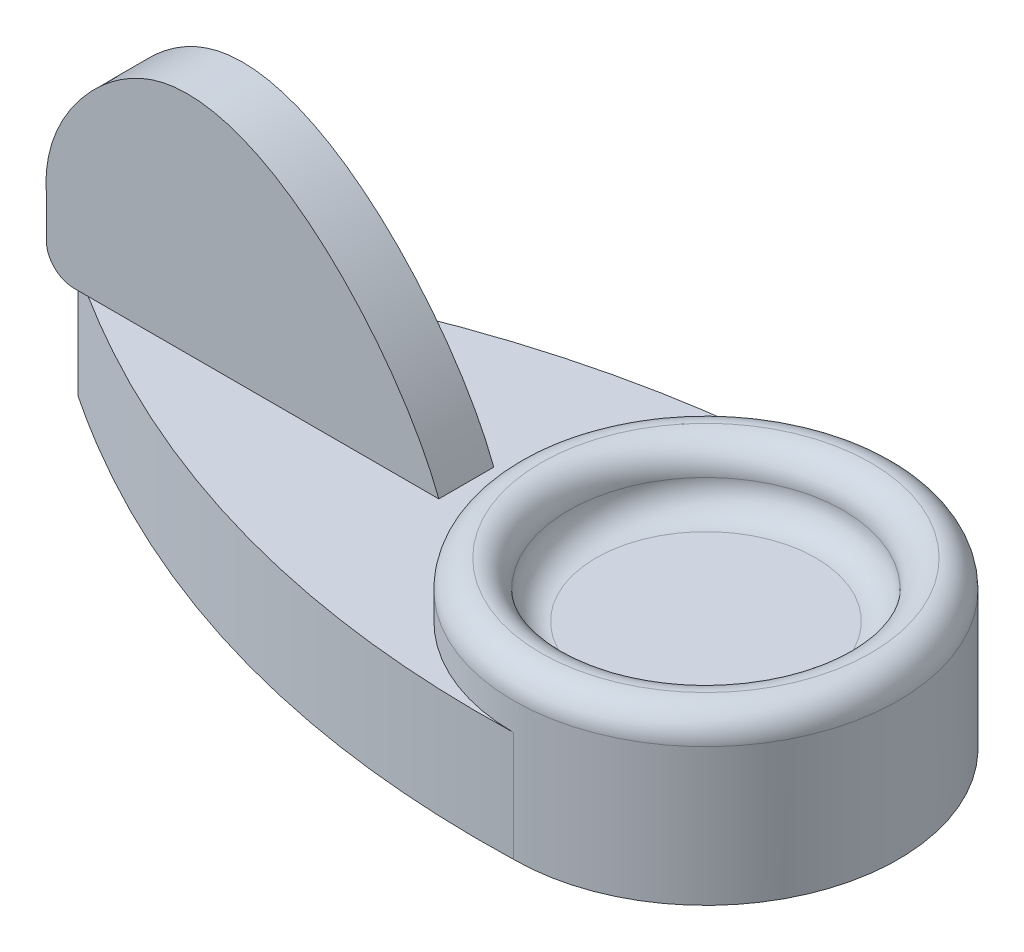
ISO-10303-21;
HEADER;
FILE_DESCRIPTION(('STEP AP214'),'2;1');
FILE_NAME('part.step','',(''),(''),'','','');
FILE_SCHEMA(('AUTOMOTIVE_DESIGN { 1 0 10303 214 1 1 1 1 }'));
ENDSEC;
DATA;
#1=APPLICATION_CONTEXT('core data for automotive mechanical design processes');
#2=APPLICATION_PROTOCOL_DEFINITION('international standard','automotive_design',2000,#1);
#3=PRODUCT_CONTEXT('',#1,'mechanical');
#4=PRODUCT('Part','Part','',(#3));
#5=PRODUCT_RELATED_PRODUCT_CATEGORY('part','',(#4));
#6=PRODUCT_DEFINITION_FORMATION('','',#4);
#7=PRODUCT_DEFINITION_CONTEXT('part definition',#1,'design');
#8=PRODUCT_DEFINITION('design','',#6,#7);
#9=PRODUCT_DEFINITION_SHAPE('','',#8);
#10=(LENGTH_UNIT() NAMED_UNIT(*) SI_UNIT(.MILLI.,.METRE.));
#11=(NAMED_UNIT(*) PLANE_ANGLE_UNIT() SI_UNIT($,.RADIAN.));
#12=(NAMED_UNIT(*) SI_UNIT($,.STERADIAN.) SOLID_ANGLE_UNIT());
#13=UNCERTAINTY_MEASURE_WITH_UNIT(LENGTH_MEASURE(1.E-05),#10,'distance_accuracy_value','');
#14=(GEOMETRIC_REPRESENTATION_CONTEXT(3) GLOBAL_UNCERTAINTY_ASSIGNED_CONTEXT((#13)) GLOBAL_UNIT_ASSIGNED_CONTEXT((#10,
#11,#12)) REPRESENTATION_CONTEXT('',''));
#15=CARTESIAN_POINT('',(0.,0.,0.));
#16=DIRECTION('',(0.,0.,1.));
#17=DIRECTION('',(1.,0.,0.));
#18=AXIS2_PLACEMENT_3D('',#15,#16,#17);
#19=CARTESIAN_POINT('',(0.,2.,-3.5));
#20=CARTESIAN_POINT('',(-6.12662455637895,2.,-3.68191208845237));
#21=CARTESIAN_POINT('',(-11.5,2.,0.));
#22=B_SPLINE_CURVE_WITH_KNOTS('',2,(#19,#20,#21),.UNSPECIFIED.,.F.,.F.,(3,3),(0.,1.),.UNSPECIFIED.);
#23=DIRECTION('',(0.,-1.,0.));
#24=VECTOR('',#23,1.);
#25=SURFACE_OF_LINEAR_EXTRUSION('',#22,#24);
#26=CARTESIAN_POINT('',(0.,0.,-3.5));
#27=CARTESIAN_POINT('',(-6.12662455637895,0.,-3.68191208845237));
#28=CARTESIAN_POINT('',(-11.5,0.,0.));
#29=B_SPLINE_CURVE_WITH_KNOTS('',2,(#26,#27,#28),.UNSPECIFIED.,.F.,.F.,(3,3),(0.,1.),.UNSPECIFIED.);
#30=CARTESIAN_POINT('',(0.,0.,-3.5));
#31=VERTEX_POINT('',#30);
#32=CARTESIAN_POINT('',(-11.2537930165559,0.,-0.166412944091893));
#33=VERTEX_POINT('',#32);
#34=EDGE_CURVE('E227',#31,#33,#29,.T.);
#35=ORIENTED_EDGE('',*,*,#34,.T.);
#36=DIRECTION('',(0.,-1.,0.));
#37=VECTOR('',#36,1.);
#38=CARTESIAN_POINT('',(-11.2537930165559,0.,-0.166412944091893));
#39=LINE('',#38,#37);
#40=CARTESIAN_POINT('',(-11.2537930165559,2.06919946059987,-0.166412944091893));
#41=VERTEX_POINT('',#40);
#42=EDGE_CURVE('E64',#33,#41,#39,.F.);
#43=ORIENTED_EDGE('',*,*,#42,.T.);
#44=CARTESIAN_POINT('',(-11.5,2.5,0.));
#45=CARTESIAN_POINT('',(-11.5000342115577,2.47530984891668,2.48383133919638E-05));
#46=CARTESIAN_POINT('',(-11.498173484816,2.4506571947434,-0.00125156162960289));
#47=CARTESIAN_POINT('',(-11.4909493854543,2.40225076338282,-0.00619935642048918));
#48=CARTESIAN_POINT('',(-11.4856052213293,2.37849280815618,-0.00985761700405208));
#49=CARTESIAN_POINT('',(-11.4717054096251,2.33244604006634,-0.0193591900303991));
#50=CARTESIAN_POINT('',(-11.4631541533999,2.31015526708196,-0.0251995146113813));
#51=CARTESIAN_POINT('',(-11.4432647767751,2.26746489563335,-0.0387575875231119));
#52=CARTESIAN_POINT('',(-11.431923337873,2.24706758924352,-0.0464775713121345));
#53=CARTESIAN_POINT('',(-11.3927428537743,2.1867249822323,-0.0730849387838425));
#54=CARTESIAN_POINT('',(-11.3607152993738,2.15065397805925,-0.0947531550935584));
#55=CARTESIAN_POINT('',(-11.2839987870565,2.08487893974673,-0.14630628510141));
#56=CARTESIAN_POINT('',(-11.2380866904511,2.05726231912831,-0.176960024748382));
#57=CARTESIAN_POINT('',(-11.1595046322122,2.02497827944877,-0.228970035971846));
#58=CARTESIAN_POINT('',(-11.128155543699,2.01560856743447,-0.249611768825755));
#59=CARTESIAN_POINT('',(-11.0645637467219,2.00313748415825,-0.291255288677737));
#60=CARTESIAN_POINT('',(-11.032323232499,2.00002190689528,-0.312256150154804));
#61=CARTESIAN_POINT('',(-11.,2.,-0.333187298877784));
#62=B_SPLINE_CURVE_WITH_KNOTS('',3,(#44,#45,#46,#47,#48,#49,#50,#51,#52,#53,#54,#55,#56,#57,#58,
#59,#60,#61),.UNSPECIFIED.,.F.,.F.,(4,2,2,2,2,2,2,2,4),(0.,0.0739080321765246,0.147411926977707,
0.220815540871396,0.294306882995868,0.450616503362289,0.633183557091156,0.748776335070717,
0.864106250511664),.UNSPECIFIED.);
#63=CARTESIAN_POINT('',(-11.0000000000001,2.,-0.333187298877697));
#64=VERTEX_POINT('',#63);
#65=EDGE_CURVE('E189',#41,#64,#62,.T.);
#66=ORIENTED_EDGE('',*,*,#65,.T.);
#67=CARTESIAN_POINT('',(-10.7385233750624,2.,-0.5));
#68=VERTEX_POINT('',#67);
#69=EDGE_CURVE('E169',#68,#64,#22,.T.);
#70=ORIENTED_EDGE('',*,*,#69,.F.);
#71=CARTESIAN_POINT('',(0.,2.,-3.5));
#72=VERTEX_POINT('',#71);
#73=EDGE_CURVE('E163',#72,#68,#22,.T.);
#74=ORIENTED_EDGE('',*,*,#73,.F.);
#75=DIRECTION('',(0.,-1.,0.));
#76=VECTOR('',#75,1.);
#77=CARTESIAN_POINT('',(0.,2.,-3.5));
#78=LINE('',#77,#76);
#79=EDGE_CURVE('E238',#72,#31,#78,.T.);
#80=ORIENTED_EDGE('',*,*,#79,.T.);
#81=EDGE_LOOP('',(#35,#43,#66,#70,#74,#80));
#82=FACE_BOUND('',#81,.T.);
#83=ADVANCED_FACE('F40',(#82),#25,.F.);
#84=CARTESIAN_POINT('',(0.,2.,3.5));
#85=CARTESIAN_POINT('',(-6.12662455637895,2.,3.68191208845237));
#86=CARTESIAN_POINT('',(-11.5,2.,0.));
#87=B_SPLINE_CURVE_WITH_KNOTS('',2,(#84,#85,#86),.UNSPECIFIED.,.F.,.F.,(3,3),(0.,1.),.UNSPECIFIED.);
#88=DIRECTION('',(0.,-1.,0.));
#89=VECTOR('',#88,1.);
#90=SURFACE_OF_LINEAR_EXTRUSION('',#87,#89);
#91=CARTESIAN_POINT('',(-11.,2.,0.333187298877786));
#92=CARTESIAN_POINT('',(-11.0178189687918,2.0000010117855,0.321647109079927));
#93=CARTESIAN_POINT('',(-11.0356212645693,2.00095266382482,0.310081519787242));
#94=CARTESIAN_POINT('',(-11.0710193700797,2.00474970720833,0.287014902992967));
#95=CARTESIAN_POINT('',(-11.0886154904419,2.00759173145211,0.275513797299421));
#96=CARTESIAN_POINT('',(-11.1236328058006,2.01519248930718,0.252557802153845));
#97=CARTESIAN_POINT('',(-11.1410514521667,2.01996646911054,0.241104030148324));
#98=CARTESIAN_POINT('',(-11.1754482917191,2.03144093393052,0.218420624183987));
#99=CARTESIAN_POINT('',(-11.1924253803144,2.0381458224744,0.207191566016232));
#100=CARTESIAN_POINT('',(-11.2397788061437,2.05994647440805,0.175782987082251));
#101=CARTESIAN_POINT('',(-11.2694114000479,2.07735578214267,0.156021465064425));
#102=CARTESIAN_POINT('',(-11.3252370877127,2.11865840070362,0.118623620654779));
#103=CARTESIAN_POINT('',(-11.3514388072831,2.14253496861813,0.100981978094591));
#104=CARTESIAN_POINT('',(-11.3918387484425,2.18839583926509,0.0736811137641697));
#105=CARTESIAN_POINT('',(-11.4072824526681,2.20880761749144,0.0632131014388433));
#106=CARTESIAN_POINT('',(-11.4351845698841,2.25244446777527,0.0442606082705913));
#107=CARTESIAN_POINT('',(-11.4476426146751,2.27566988628717,0.0357763720753504));
#108=CARTESIAN_POINT('',(-11.4690074586984,2.32463937241546,0.0212045031108009));
#109=CARTESIAN_POINT('',(-11.4778864258101,2.35040131148765,0.0151356576759938));
#110=CARTESIAN_POINT('',(-11.4913568961627,2.40349422783249,0.00592131537121679));
#111=CARTESIAN_POINT('',(-11.4959599047993,2.43082078332659,0.00276797381272133));
#112=CARTESIAN_POINT('',(-11.498843182324,2.46529613667982,0.000792614147605484));
#113=CARTESIAN_POINT('',(-11.4992769832548,2.47223120419034,0.000495399207977034));
#114=CARTESIAN_POINT('',(-11.499854902603,2.48610975620824,9.9430485872398E-05));
#115=CARTESIAN_POINT('',(-11.4999994080909,2.49305321701465,4.11521873627771E-07));
#116=CARTESIAN_POINT('',(-11.5,2.5,0.));
#117=B_SPLINE_CURVE_WITH_KNOTS('',3,(#91,#92,#93,#94,#95,#96,#97,#98,#99,#100,#101,#102,#103,
#104,#105,#106,#107,#108,#109,#110,#111,#112,#113,#114,#115,#116),.UNSPECIFIED.,.F.,.F.,(4,2,2,
2,2,2,2,2,2,2,2,2,4),(0.,0.0636667112676558,0.127220323013127,0.1912855702723,0.255498094257199,
0.373734269404229,0.491667224448291,0.574302800189985,0.65694856153256,0.740225149665953,
0.823277009439444,0.844136449247156,0.864967960912051),.UNSPECIFIED.);
#118=CARTESIAN_POINT('',(-11.,2.,0.333187298877786));
#119=VERTEX_POINT('',#118);
#120=CARTESIAN_POINT('',(-11.2537930165561,2.06919946059995,0.166412944091806));
#121=VERTEX_POINT('',#120);
#122=EDGE_CURVE('E56',#119,#121,#117,.T.);
#123=ORIENTED_EDGE('',*,*,#122,.T.);
#124=DIRECTION('',(0.,-1.,0.));
#125=VECTOR('',#124,1.);
#126=CARTESIAN_POINT('',(-11.2537930165559,2.06919946059995,0.166412944091895));
#127=LINE('',#126,#125);
#128=CARTESIAN_POINT('',(-11.2537930165559,0.,0.166412944091895));
#129=VERTEX_POINT('',#128);
#130=EDGE_CURVE('E195',#121,#129,#127,.T.);
#131=ORIENTED_EDGE('',*,*,#130,.T.);
#132=CARTESIAN_POINT('',(0.,0.,3.5));
#133=CARTESIAN_POINT('',(-6.12662455637895,0.,3.68191208845237));
#134=CARTESIAN_POINT('',(-11.5,0.,0.));
#135=B_SPLINE_CURVE_WITH_KNOTS('',2,(#132,#133,#134),.UNSPECIFIED.,.F.,.F.,(3,3),(0.,1.),.UNSPECIFIED.);
#136=CARTESIAN_POINT('',(0.,0.,3.5));
#137=VERTEX_POINT('',#136);
#138=EDGE_CURVE('E221',#137,#129,#135,.T.);
#139=ORIENTED_EDGE('',*,*,#138,.F.);
#140=DIRECTION('',(0.,-1.,0.));
#141=VECTOR('',#140,1.);
#142=CARTESIAN_POINT('',(0.,2.,3.5));
#143=LINE('',#142,#141);
#144=CARTESIAN_POINT('',(0.,2.,3.5));
#145=VERTEX_POINT('',#144);
#146=EDGE_CURVE('E162',#145,#137,#143,.T.);
#147=ORIENTED_EDGE('',*,*,#146,.F.);
#148=CARTESIAN_POINT('',(-10.7385233750624,2.,0.5));
#149=VERTEX_POINT('',#148);
#150=EDGE_CURVE('E170',#145,#149,#87,.T.);
#151=ORIENTED_EDGE('',*,*,#150,.T.);
#152=EDGE_CURVE('E168',#149,#119,#87,.T.);
#153=ORIENTED_EDGE('',*,*,#152,.T.);
#154=EDGE_LOOP('',(#123,#131,#139,#147,#151,#153));
#155=FACE_BOUND('',#154,.T.);
#156=ADVANCED_FACE('F183',(#155),#90,.T.);
#157=CARTESIAN_POINT('',(0.,2.,0.));
#158=DIRECTION('',(0.,-1.,0.));
#159=DIRECTION('',(0.,0.,-1.));
#160=AXIS2_PLACEMENT_3D('',#157,#158,#159);
#161=CYLINDRICAL_SURFACE('',#160,3.5);
#162=CARTESIAN_POINT('',(0.,2.5,0.));
#163=DIRECTION('',(0.,1.,0.));
#164=DIRECTION('',(0.,0.,1.));
#165=AXIS2_PLACEMENT_3D('',#162,#163,#164);
#166=CIRCLE('',#165,3.5);
#167=CARTESIAN_POINT('',(0.,2.5,3.5));
#168=VERTEX_POINT('',#167);
#169=EDGE_CURVE('E244',#168,#168,#166,.F.);
#170=ORIENTED_EDGE('',*,*,#169,.T.);
#171=EDGE_LOOP('',(#170));
#172=FACE_BOUND('',#171,.T.);
#173=CARTESIAN_POINT('',(0.,0.,0.));
#174=DIRECTION('',(0.,1.,0.));
#175=DIRECTION('',(0.,0.,1.));
#176=AXIS2_PLACEMENT_3D('',#173,#174,#175);
#177=CIRCLE('',#176,3.5);
#178=EDGE_CURVE('E226',#137,#31,#177,.T.);
#179=ORIENTED_EDGE('',*,*,#178,.T.);
#180=ORIENTED_EDGE('',*,*,#79,.F.);
#181=CARTESIAN_POINT('',(0.,2.,0.));
#182=DIRECTION('',(0.,1.,0.));
#183=DIRECTION('',(0.,0.,1.));
#184=AXIS2_PLACEMENT_3D('',#181,#182,#183);
#185=CIRCLE('',#184,3.5);
#186=EDGE_CURVE('E158',#72,#145,#185,.T.);
#187=ORIENTED_EDGE('',*,*,#186,.T.);
#188=ORIENTED_EDGE('',*,*,#146,.T.);
#189=EDGE_LOOP('',(#179,#180,#187,#188));
#190=FACE_BOUND('',#189,.T.);
#191=ADVANCED_FACE('F294',(#172,#190),#161,.T.);
#192=CARTESIAN_POINT('',(0.,2.,0.));
#193=DIRECTION('',(0.,1.,0.));
#194=DIRECTION('',(0.,0.,1.));
#195=AXIS2_PLACEMENT_3D('',#192,#193,#194);
#196=PLANE('',#195);
#197=DIRECTION('',(1.,0.,0.));
#198=VECTOR('',#197,1.);
#199=CARTESIAN_POINT('',(0.,2.,0.5));
#200=LINE('',#199,#198);
#201=CARTESIAN_POINT('',(-4.35975113165469,2.,0.5));
#202=VERTEX_POINT('',#201);
#203=EDGE_CURVE('E122',#149,#202,#200,.T.);
#204=ORIENTED_EDGE('',*,*,#203,.F.);
#205=ORIENTED_EDGE('',*,*,#150,.F.);
#206=ORIENTED_EDGE('',*,*,#186,.F.);
#207=ORIENTED_EDGE('',*,*,#73,.T.);
#208=DIRECTION('',(1.,0.,0.));
#209=VECTOR('',#208,1.);
#210=CARTESIAN_POINT('',(0.,2.,-0.5));
#211=LINE('',#210,#209);
#212=CARTESIAN_POINT('',(-4.35975113165469,2.,-0.5));
#213=VERTEX_POINT('',#212);
#214=EDGE_CURVE('E135',#68,#213,#211,.T.);
#215=ORIENTED_EDGE('',*,*,#214,.T.);
#216=DIRECTION('',(0.,0.,-1.));
#217=VECTOR('',#216,1.);
#218=CARTESIAN_POINT('',(-4.35975113165469,2.,0.5));
#219=LINE('',#218,#217);
#220=EDGE_CURVE('E139',#202,#213,#219,.T.);
#221=ORIENTED_EDGE('',*,*,#220,.F.);
#222=EDGE_LOOP('',(#204,#205,#206,#207,#215,#221));
#223=FACE_BOUND('',#222,.T.);
#224=ADVANCED_FACE('F147',(#223),#196,.T.);
#225=CARTESIAN_POINT('',(0.,0.,0.));
#226=DIRECTION('',(0.,1.,0.));
#227=DIRECTION('',(0.,0.,1.));
#228=AXIS2_PLACEMENT_3D('',#225,#226,#227);
#229=PLANE('',#228);
#230=CARTESIAN_POINT('',(0.,0.,0.));
#231=DIRECTION('',(0.,1.,0.));
#232=DIRECTION('',(0.,0.,1.));
#233=AXIS2_PLACEMENT_3D('',#230,#231,#232);
#234=CIRCLE('',#233,1.);
#235=CARTESIAN_POINT('',(0.,0.,1.));
#236=VERTEX_POINT('',#235);
#237=EDGE_CURVE('E12',#236,#236,#234,.F.);
#238=ORIENTED_EDGE('',*,*,#237,.F.);
#239=EDGE_LOOP('',(#238));
#240=FACE_BOUND('',#239,.T.);
#241=ORIENTED_EDGE('',*,*,#138,.T.);
#242=CARTESIAN_POINT('',(-11.1428573052693,0.,0.));
#243=DIRECTION('',(0.,1.,0.));
#244=DIRECTION('',(0.,0.,1.));
#245=AXIS2_PLACEMENT_3D('',#242,#243,#244);
#246=CIRCLE('',#245,0.2);
#247=EDGE_CURVE('E214',#129,#33,#246,.F.);
#248=ORIENTED_EDGE('',*,*,#247,.T.);
#249=ORIENTED_EDGE('',*,*,#34,.F.);
#250=ORIENTED_EDGE('',*,*,#178,.F.);
#251=EDGE_LOOP('',(#241,#248,#249,#250));
#252=FACE_BOUND('',#251,.T.);
#253=ADVANCED_FACE('F225',(#240,#252),#229,.F.);
#254=CARTESIAN_POINT('',(0.,2.,0.));
#255=DIRECTION('',(0.,1.,0.));
#256=DIRECTION('',(0.,0.,1.));
#257=AXIS2_PLACEMENT_3D('',#254,#255,#256);
#258=CIRCLE('',#257,2.);
#259=CARTESIAN_POINT('',(0.,2.,2.));
#260=VERTEX_POINT('',#259);
#261=EDGE_CURVE('E161',#260,#260,#258,.T.);
#262=ORIENTED_EDGE('',*,*,#261,.T.);
#263=EDGE_LOOP('',(#262));
#264=FACE_BOUND('',#263,.T.);
#265=ADVANCED_FACE('F311',(#264),#196,.T.);
#266=CARTESIAN_POINT('',(0.,2.5,0.));
#267=DIRECTION('',(0.,1.,0.));
#268=DIRECTION('',(0.,0.,1.));
#269=AXIS2_PLACEMENT_3D('',#266,#267,#268);
#270=TOROIDAL_SURFACE('',#269,3.,0.5);
#271=ORIENTED_EDGE('',*,*,#169,.F.);
#272=EDGE_LOOP('',(#271));
#273=FACE_BOUND('',#272,.T.);
#274=CARTESIAN_POINT('',(0.,3.,0.));
#275=DIRECTION('',(0.,1.,0.));
#276=DIRECTION('',(0.,0.,1.));
#277=AXIS2_PLACEMENT_3D('',#274,#275,#276);
#278=CIRCLE('',#277,3.);
#279=CARTESIAN_POINT('',(0.,3.,3.));
#280=VERTEX_POINT('',#279);
#281=EDGE_CURVE('E153',#280,#280,#278,.T.);
#282=ORIENTED_EDGE('',*,*,#281,.F.);
#283=EDGE_LOOP('',(#282));
#284=FACE_BOUND('',#283,.T.);
#285=ADVANCED_FACE('F321',(#273,#284),#270,.T.);
#286=CARTESIAN_POINT('',(0.,2.5,0.));
#287=DIRECTION('',(0.,1.,0.));
#288=DIRECTION('',(0.,0.,1.));
#289=AXIS2_PLACEMENT_3D('',#286,#287,#288);
#290=TOROIDAL_SURFACE('',#289,3.,0.5);
#291=ORIENTED_EDGE('',*,*,#281,.T.);
#292=EDGE_LOOP('',(#291));
#293=FACE_BOUND('',#292,.T.);
#294=CARTESIAN_POINT('',(0.,2.5,0.));
#295=DIRECTION('',(0.,1.,0.));
#296=DIRECTION('',(0.,0.,1.));
#297=AXIS2_PLACEMENT_3D('',#294,#295,#296);
#298=CIRCLE('',#297,2.5);
#299=CARTESIAN_POINT('',(0.,2.5,2.5));
#300=VERTEX_POINT('',#299);
#301=EDGE_CURVE('E150',#300,#300,#298,.T.);
#302=ORIENTED_EDGE('',*,*,#301,.F.);
#303=EDGE_LOOP('',(#302));
#304=FACE_BOUND('',#303,.T.);
#305=ADVANCED_FACE('F304',(#293,#304),#290,.T.);
#306=CARTESIAN_POINT('',(0.,2.5,0.));
#307=DIRECTION('',(0.,1.,0.));
#308=DIRECTION('',(0.,0.,1.));
#309=AXIS2_PLACEMENT_3D('',#306,#307,#308);
#310=TOROIDAL_SURFACE('',#309,2.,0.5);
#311=ORIENTED_EDGE('',*,*,#301,.T.);
#312=EDGE_LOOP('',(#311));
#313=FACE_BOUND('',#312,.T.);
#314=ORIENTED_EDGE('',*,*,#261,.F.);
#315=EDGE_LOOP('',(#314));
#316=FACE_BOUND('',#315,.T.);
#317=ADVANCED_FACE('F186',(#313,#316),#310,.F.);
#318=CARTESIAN_POINT('',(-4.35975113165469,2.,0.5));
#319=DIRECTION('',(0.,1.,0.));
#320=DIRECTION('',(0.,0.,1.));
#321=AXIS2_PLACEMENT_3D('',#318,#319,#320);
#322=PLANE('',#321);
#323=ORIENTED_EDGE('',*,*,#69,.T.);
#324=DIRECTION('',(0.,0.,-1.));
#325=VECTOR('',#324,1.);
#326=CARTESIAN_POINT('',(-11.,2.,0.5));
#327=LINE('',#326,#325);
#328=CARTESIAN_POINT('',(-11.,2.,-0.5));
#329=VERTEX_POINT('',#328);
#330=EDGE_CURVE('E258',#64,#329,#327,.T.);
#331=ORIENTED_EDGE('',*,*,#330,.T.);
#332=DIRECTION('',(1.,0.,0.));
#333=VECTOR('',#332,1.);
#334=CARTESIAN_POINT('',(-4.35975113165469,2.,-0.5));
#335=LINE('',#334,#333);
#336=EDGE_CURVE('E266',#329,#68,#335,.T.);
#337=ORIENTED_EDGE('',*,*,#336,.T.);
#338=EDGE_LOOP('',(#323,#331,#337));
#339=FACE_BOUND('',#338,.T.);
#340=ADVANCED_FACE('F295',(#339),#322,.F.);
#341=DIRECTION('',(1.,0.,0.));
#342=VECTOR('',#341,1.);
#343=CARTESIAN_POINT('',(-4.35975113165469,2.,0.5));
#344=LINE('',#343,#342);
#345=CARTESIAN_POINT('',(-11.,2.,0.5));
#346=VERTEX_POINT('',#345);
#347=EDGE_CURVE('E129',#346,#149,#344,.T.);
#348=ORIENTED_EDGE('',*,*,#347,.F.);
#349=DIRECTION('',(0.,0.,-1.));
#350=VECTOR('',#349,1.);
#351=CARTESIAN_POINT('',(-11.,2.,0.5));
#352=LINE('',#351,#350);
#353=EDGE_CURVE('E134',#346,#119,#352,.T.);
#354=ORIENTED_EDGE('',*,*,#353,.T.);
#355=ORIENTED_EDGE('',*,*,#152,.F.);
#356=EDGE_LOOP('',(#348,#354,#355));
#357=FACE_BOUND('',#356,.T.);
#358=ADVANCED_FACE('F297',(#357),#322,.F.);
#359=CARTESIAN_POINT('',(-4.35975113165469,2.,0.5));
#360=CARTESIAN_POINT('',(-5.06299635911789,3.86915644778819,0.5));
#361=CARTESIAN_POINT('',(-8.14366180073848,7.3520515526818,0.5));
#362=CARTESIAN_POINT('',(-11.0898107099426,5.03591050180605,0.5));
#363=CARTESIAN_POINT('',(-11.548097354163,3.87260267931938,0.5));
#364=CARTESIAN_POINT('',(-11.5,3.25123950934847,0.5));
#365=B_SPLINE_CURVE_WITH_KNOTS('',3,(#359,#360,#361,#362,#363,#364),.UNSPECIFIED.,.F.,.F.,(4,1,
1,4),(0.,0.654566651674331,0.819230389670433,1.),.UNSPECIFIED.);
#366=DIRECTION('',(0.,0.,-1.));
#367=VECTOR('',#366,1.);
#368=SURFACE_OF_LINEAR_EXTRUSION('',#365,#367);
#369=CARTESIAN_POINT('',(-4.35975113165469,2.,-0.5));
#370=CARTESIAN_POINT('',(-5.06299635911789,3.86915644778819,-0.5));
#371=CARTESIAN_POINT('',(-8.14366180073848,7.3520515526818,-0.5));
#372=CARTESIAN_POINT('',(-11.0898107099426,5.03591050180605,-0.5));
#373=CARTESIAN_POINT('',(-11.548097354163,3.87260267931938,-0.5));
#374=CARTESIAN_POINT('',(-11.5,3.25123950934847,-0.5));
#375=B_SPLINE_CURVE_WITH_KNOTS('',3,(#369,#370,#371,#372,#373,#374),.UNSPECIFIED.,.F.,.F.,(4,1,
1,4),(0.,0.654566651674331,0.819230389670433,1.),.UNSPECIFIED.);
#376=CARTESIAN_POINT('',(-11.5,3.25123950934847,-0.5));
#377=VERTEX_POINT('',#376);
#378=EDGE_CURVE('E272',#213,#377,#375,.T.);
#379=ORIENTED_EDGE('',*,*,#378,.T.);
#380=DIRECTION('',(0.,0.,-1.));
#381=VECTOR('',#380,1.);
#382=CARTESIAN_POINT('',(-11.5,3.25123950934847,0.5));
#383=LINE('',#382,#381);
#384=CARTESIAN_POINT('',(-11.5,3.25123950934847,0.5));
#385=VERTEX_POINT('',#384);
#386=EDGE_CURVE('E142',#385,#377,#383,.T.);
#387=ORIENTED_EDGE('',*,*,#386,.F.);
#388=EDGE_CURVE('E126',#202,#385,#365,.T.);
#389=ORIENTED_EDGE('',*,*,#388,.F.);
#390=ORIENTED_EDGE('',*,*,#220,.T.);
#391=EDGE_LOOP('',(#379,#387,#389,#390));
#392=FACE_BOUND('',#391,.T.);
#393=ADVANCED_FACE('F138',(#392),#368,.F.);
#394=CARTESIAN_POINT('',(-11.5,2.,0.5));
#395=DIRECTION('',(1.,0.,0.));
#396=DIRECTION('',(0.,0.,-1.));
#397=AXIS2_PLACEMENT_3D('',#394,#395,#396);
#398=PLANE('',#397);
#399=DIRECTION('',(0.,0.,-1.));
#400=VECTOR('',#399,1.);
#401=CARTESIAN_POINT('',(-11.5,2.5,0.5));
#402=LINE('',#401,#400);
#403=CARTESIAN_POINT('',(-11.5,2.5,-0.5));
#404=VERTEX_POINT('',#403);
#405=CARTESIAN_POINT('',(-11.5,2.5,0.));
#406=VERTEX_POINT('',#405);
#407=EDGE_CURVE('E252',#404,#406,#402,.F.);
#408=ORIENTED_EDGE('',*,*,#407,.T.);
#409=DIRECTION('',(0.,0.,-1.));
#410=VECTOR('',#409,1.);
#411=CARTESIAN_POINT('',(-11.5,2.5,0.5));
#412=LINE('',#411,#410);
#413=CARTESIAN_POINT('',(-11.5,2.5,0.5));
#414=VERTEX_POINT('',#413);
#415=EDGE_CURVE('E254',#406,#414,#412,.F.);
#416=ORIENTED_EDGE('',*,*,#415,.T.);
#417=DIRECTION('',(0.,-1.,0.));
#418=VECTOR('',#417,1.);
#419=CARTESIAN_POINT('',(-11.5,2.,0.5));
#420=LINE('',#419,#418);
#421=EDGE_CURVE('E144',#385,#414,#420,.T.);
#422=ORIENTED_EDGE('',*,*,#421,.F.);
#423=ORIENTED_EDGE('',*,*,#386,.T.);
#424=DIRECTION('',(0.,-1.,0.));
#425=VECTOR('',#424,1.);
#426=CARTESIAN_POINT('',(-11.5,2.,-0.5));
#427=LINE('',#426,#425);
#428=EDGE_CURVE('E265',#377,#404,#427,.T.);
#429=ORIENTED_EDGE('',*,*,#428,.T.);
#430=EDGE_LOOP('',(#408,#416,#422,#423,#429));
#431=FACE_BOUND('',#430,.T.);
#432=ADVANCED_FACE('F270',(#431),#398,.F.);
#433=CARTESIAN_POINT('',(-8.07553243794372,5.94455509720326,0.5));
#434=DIRECTION('',(0.,0.,1.));
#435=DIRECTION('',(1.,0.,0.));
#436=AXIS2_PLACEMENT_3D('',#433,#434,#435);
#437=PLANE('',#436);
#438=ORIENTED_EDGE('',*,*,#421,.T.);
#439=CARTESIAN_POINT('',(-11.,2.5,0.5));
#440=DIRECTION('',(0.,0.,1.));
#441=DIRECTION('',(1.,0.,0.));
#442=AXIS2_PLACEMENT_3D('',#439,#440,#441);
#443=CIRCLE('',#442,0.5);
#444=EDGE_CURVE('E256',#414,#346,#443,.T.);
#445=ORIENTED_EDGE('',*,*,#444,.T.);
#446=ORIENTED_EDGE('',*,*,#347,.T.);
#447=ORIENTED_EDGE('',*,*,#203,.T.);
#448=ORIENTED_EDGE('',*,*,#388,.T.);
#449=EDGE_LOOP('',(#438,#445,#446,#447,#448));
#450=FACE_BOUND('',#449,.T.);
#451=ADVANCED_FACE('F125',(#450),#437,.T.);
#452=CARTESIAN_POINT('',(-8.07553243794372,5.94455509720326,-0.5));
#453=DIRECTION('',(0.,0.,1.));
#454=DIRECTION('',(1.,0.,0.));
#455=AXIS2_PLACEMENT_3D('',#452,#453,#454);
#456=PLANE('',#455);
#457=ORIENTED_EDGE('',*,*,#336,.F.);
#458=CARTESIAN_POINT('',(-11.,2.5,-0.5));
#459=DIRECTION('',(0.,0.,1.));
#460=DIRECTION('',(1.,0.,0.));
#461=AXIS2_PLACEMENT_3D('',#458,#459,#460);
#462=CIRCLE('',#461,0.5);
#463=EDGE_CURVE('E259',#329,#404,#462,.F.);
#464=ORIENTED_EDGE('',*,*,#463,.T.);
#465=ORIENTED_EDGE('',*,*,#428,.F.);
#466=ORIENTED_EDGE('',*,*,#378,.F.);
#467=ORIENTED_EDGE('',*,*,#214,.F.);
#468=EDGE_LOOP('',(#457,#464,#465,#466,#467));
#469=FACE_BOUND('',#468,.T.);
#470=ADVANCED_FACE('F205',(#469),#456,.F.);
#471=CARTESIAN_POINT('',(-11.,2.5,0.5));
#472=DIRECTION('',(0.,0.,-1.));
#473=DIRECTION('',(-1.,0.,0.));
#474=AXIS2_PLACEMENT_3D('',#471,#472,#473);
#475=CYLINDRICAL_SURFACE('',#474,0.5);
#476=ORIENTED_EDGE('',*,*,#330,.F.);
#477=ORIENTED_EDGE('',*,*,#65,.F.);
#478=CARTESIAN_POINT('',(-11.2537930165559,2.06919946059987,-0.166412944091893));
#479=CARTESIAN_POINT('',(-11.263777256659,2.07506755739549,-0.159743315615599));
#480=CARTESIAN_POINT('',(-11.273140304164,2.08106455630444,-0.15221468091778));
#481=CARTESIAN_POINT('',(-11.2904996834725,2.09291491066075,-0.135461382353431));
#482=CARTESIAN_POINT('',(-11.2984837426655,2.09876661522711,-0.126222867718116));
#483=CARTESIAN_POINT('',(-11.3114085268369,2.10874734857477,-0.108115732110019));
#484=CARTESIAN_POINT('',(-11.3166392363487,2.11299118537627,-0.0995180398793944));
#485=CARTESIAN_POINT('',(-11.3258357894883,2.12070218788804,-0.0813742187828931));
#486=CARTESIAN_POINT('',(-11.3298059476157,2.12417199049057,-0.0718314749967287));
#487=CARTESIAN_POINT('',(-11.3356371351881,2.12937896526542,-0.0539088947947153));
#488=CARTESIAN_POINT('',(-11.3377606899775,2.1313235438236,-0.0456756963716471));
#489=CARTESIAN_POINT('',(-11.3409515215008,2.13427211537921,-0.0288419926545497));
#490=CARTESIAN_POINT('',(-11.3420196071061,2.13527682862208,-0.0202417739123042));
#491=CARTESIAN_POINT('',(-11.3430259375495,2.13622292960457,-0.00288409242671705));
#492=CARTESIAN_POINT('',(-11.3429601587486,2.13616053058845,0.00587382008462055));
#493=CARTESIAN_POINT('',(-11.3416939947759,2.1349713785075,0.0232335863435382));
#494=CARTESIAN_POINT('',(-11.3404931948037,2.13384423632594,0.0318353818658467));
#495=CARTESIAN_POINT('',(-11.3371217821003,2.13073889611729,0.0482536038677735));
#496=CARTESIAN_POINT('',(-11.3349982565563,2.12880217416363,0.0560879562541175));
#497=CARTESIAN_POINT('',(-11.3298995042024,2.12426344603748,0.0712703522284661));
#498=CARTESIAN_POINT('',(-11.3269236164049,2.12166092371986,0.07861801293224));
#499=CARTESIAN_POINT('',(-11.3185872807598,2.11458512783334,0.096199497066448));
#500=CARTESIAN_POINT('',(-11.3127709954862,2.10981758964637,0.106099119028461));
#501=CARTESIAN_POINT('',(-11.2997206900976,2.09970537923816,0.12458842841689));
#502=CARTESIAN_POINT('',(-11.2924843606909,2.09435977340011,0.133175941068667));
#503=CARTESIAN_POINT('',(-11.279907461016,2.0856512178874,0.145815035406052));
#504=CARTESIAN_POINT('',(-11.2749622019238,2.08234803067223,0.150309499165676));
#505=CARTESIAN_POINT('',(-11.2646734212916,2.07575328534588,0.158760269499523));
#506=CARTESIAN_POINT('',(-11.2593319099344,2.07246174682961,0.162719038544011));
#507=CARTESIAN_POINT('',(-11.2537930165559,2.06919946059988,0.166412944091878));
#508=B_SPLINE_CURVE_WITH_KNOTS('',3,(#478,#479,#480,#481,#482,#483,#484,#485,#486,#487,#488,
#489,#490,#491,#492,#493,#494,#495,#496,#497,#498,#499,#500,#501,#502,#503,#504,#505,#506,#507),
.UNSPECIFIED.,.F.,.F.,(4,2,2,2,2,2,2,2,2,2,2,2,2,2,4),(0.,0.0400885359491406,0.0805172739193726,
0.113166162573169,0.145702067906217,0.171761422548969,0.197800790770052,0.22393258143588,
0.250073925816101,0.27501434360489,0.299974154731133,0.337072572874245,0.374231828442958,
0.396567528589506,0.418796790147325),.UNSPECIFIED.);
#509=EDGE_CURVE('E49',#41,#121,#508,.T.);
#510=ORIENTED_EDGE('',*,*,#509,.T.);
#511=ORIENTED_EDGE('',*,*,#122,.F.);
#512=ORIENTED_EDGE('',*,*,#353,.F.);
#513=ORIENTED_EDGE('',*,*,#444,.F.);
#514=ORIENTED_EDGE('',*,*,#415,.F.);
#515=ORIENTED_EDGE('',*,*,#407,.F.);
#516=ORIENTED_EDGE('',*,*,#463,.F.);
#517=EDGE_LOOP('',(#476,#477,#510,#511,#512,#513,#514,#515,#516));
#518=FACE_BOUND('',#517,.T.);
#519=ADVANCED_FACE('F202',(#518),#475,.T.);
#520=CARTESIAN_POINT('',(-11.1428573052693,1.25,0.));
#521=DIRECTION('',(0.,-1.,0.));
#522=DIRECTION('',(0.,0.,-1.));
#523=AXIS2_PLACEMENT_3D('',#520,#521,#522);
#524=CYLINDRICAL_SURFACE('',#523,0.2);
#525=ORIENTED_EDGE('',*,*,#509,.F.);
#526=ORIENTED_EDGE('',*,*,#42,.F.);
#527=ORIENTED_EDGE('',*,*,#247,.F.);
#528=ORIENTED_EDGE('',*,*,#130,.F.);
#529=EDGE_LOOP('',(#525,#526,#527,#528));
#530=FACE_BOUND('',#529,.T.);
#531=ADVANCED_FACE('F42',(#530),#524,.T.);
#532=CARTESIAN_POINT('',(0.,-1.,0.));
#533=DIRECTION('',(0.,1.,0.));
#534=DIRECTION('',(0.,0.,1.));
#535=AXIS2_PLACEMENT_3D('',#532,#533,#534);
#536=CYLINDRICAL_SURFACE('',#535,1.);
#537=CARTESIAN_POINT('',(0.,-1.,0.));
#538=DIRECTION('',(0.,-1.,0.));
#539=DIRECTION('',(0.,0.,-1.));
#540=AXIS2_PLACEMENT_3D('',#537,#538,#539);
#541=CIRCLE('',#540,1.);
#542=CARTESIAN_POINT('',(0.,-1.,-1.));
#543=VERTEX_POINT('',#542);
#544=EDGE_CURVE('E282',#543,#543,#541,.T.);
#545=ORIENTED_EDGE('',*,*,#544,.F.);
#546=EDGE_LOOP('',(#545));
#547=FACE_BOUND('',#546,.T.);
#548=ORIENTED_EDGE('',*,*,#237,.T.);
#549=EDGE_LOOP('',(#548));
#550=FACE_BOUND('',#549,.T.);
#551=ADVANCED_FACE('F425',(#547,#550),#536,.T.);
#552=CARTESIAN_POINT('',(0.,-1.,0.));
#553=DIRECTION('',(0.,-1.,0.));
#554=DIRECTION('',(0.,0.,-1.));
#555=AXIS2_PLACEMENT_3D('',#552,#553,#554);
#556=PLANE('',#555);
#557=ORIENTED_EDGE('',*,*,#544,.T.);
#558=EDGE_LOOP('',(#557));
#559=FACE_BOUND('',#558,.T.);
#560=ADVANCED_FACE('F440',(#559),#556,.T.);
#561=CLOSED_SHELL('',(#83,#156,#191,#224,#253,#265,#285,#305,#317,#340,#358,#393,#432,#451,#470,
#519,#531,#551,#560));
#562=MANIFOLD_SOLID_BREP('B2',#561);
#563=ADVANCED_BREP_SHAPE_REPRESENTATION('',(#18,#562),#14);
#564=SHAPE_DEFINITION_REPRESENTATION(#9,#563);
ENDSEC;
END-ISO-10303-21;
